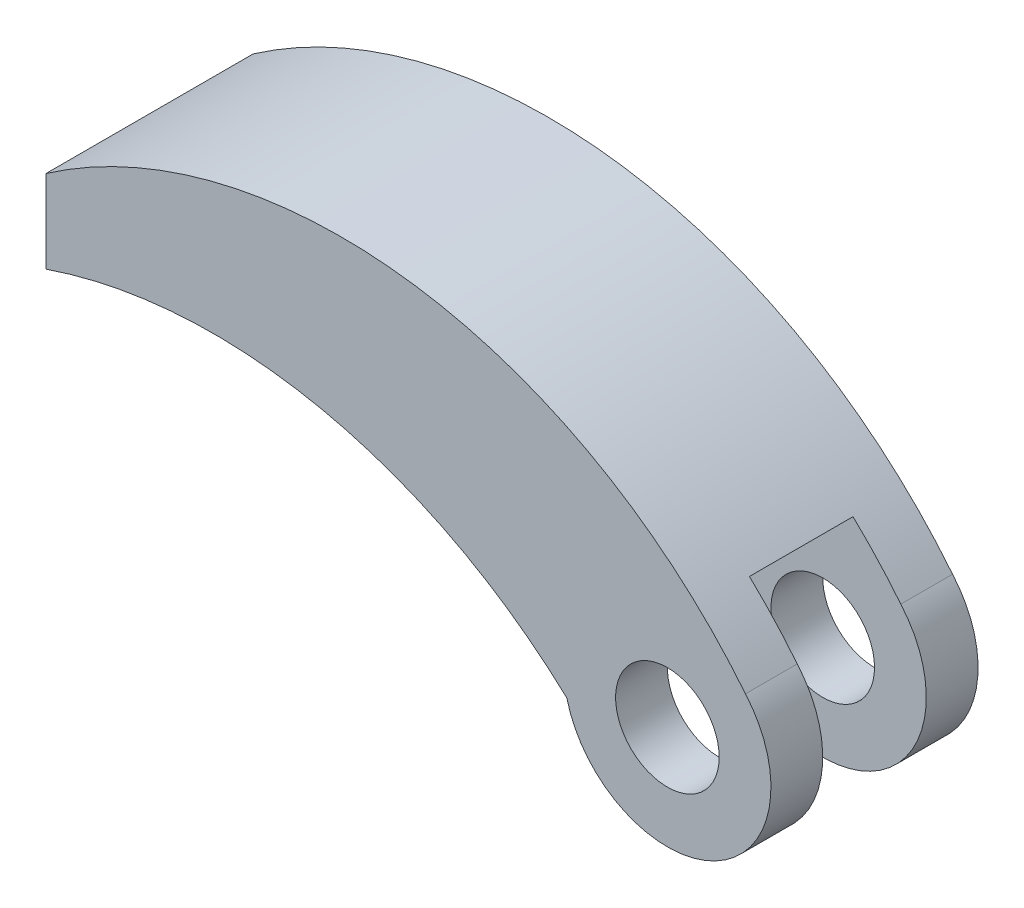
ISO-10303-21;
HEADER;
FILE_DESCRIPTION(('STEP AP214'),'2;1');
FILE_NAME('part.step','',(''),(''),'','','');
FILE_SCHEMA(('AUTOMOTIVE_DESIGN { 1 0 10303 214 1 1 1 1 }'));
ENDSEC;
DATA;
#1=APPLICATION_CONTEXT('core data for automotive mechanical design processes');
#2=APPLICATION_PROTOCOL_DEFINITION('international standard','automotive_design',2000,#1);
#3=PRODUCT_CONTEXT('',#1,'mechanical');
#4=PRODUCT('Part','Part','',(#3));
#5=PRODUCT_RELATED_PRODUCT_CATEGORY('part','',(#4));
#6=PRODUCT_DEFINITION_FORMATION('','',#4);
#7=PRODUCT_DEFINITION_CONTEXT('part definition',#1,'design');
#8=PRODUCT_DEFINITION('design','',#6,#7);
#9=PRODUCT_DEFINITION_SHAPE('','',#8);
#10=(LENGTH_UNIT() NAMED_UNIT(*) SI_UNIT(.MILLI.,.METRE.));
#11=(NAMED_UNIT(*) PLANE_ANGLE_UNIT() SI_UNIT($,.RADIAN.));
#12=(NAMED_UNIT(*) SI_UNIT($,.STERADIAN.) SOLID_ANGLE_UNIT());
#13=UNCERTAINTY_MEASURE_WITH_UNIT(LENGTH_MEASURE(1.E-05),#10,'distance_accuracy_value','');
#14=(GEOMETRIC_REPRESENTATION_CONTEXT(3) GLOBAL_UNCERTAINTY_ASSIGNED_CONTEXT((#13)) GLOBAL_UNIT_ASSIGNED_CONTEXT((#10,
#11,#12)) REPRESENTATION_CONTEXT('',''));
#15=CARTESIAN_POINT('',(0.,0.,0.));
#16=DIRECTION('',(0.,0.,1.));
#17=DIRECTION('',(1.,0.,0.));
#18=AXIS2_PLACEMENT_3D('',#15,#16,#17);
#19=CARTESIAN_POINT('',(0.,0.,10.));
#20=DIRECTION('',(0.,0.,-1.));
#21=DIRECTION('',(-1.,0.,0.));
#22=AXIS2_PLACEMENT_3D('',#19,#20,#21);
#23=CYLINDRICAL_SURFACE('',#22,5.);
#24=CARTESIAN_POINT('',(0.,0.,2.5));
#25=DIRECTION('',(0.,0.,1.));
#26=DIRECTION('',(1.,0.,0.));
#27=AXIS2_PLACEMENT_3D('',#24,#25,#26);
#28=CIRCLE('',#27,5.);
#29=CARTESIAN_POINT('',(-4.85386703858293,-1.19998948818653,2.5));
#30=VERTEX_POINT('',#29);
#31=CARTESIAN_POINT('',(3.76901553288614,3.28550177489878,2.5));
#32=VERTEX_POINT('',#31);
#33=EDGE_CURVE('E60',#30,#32,#28,.T.);
#34=ORIENTED_EDGE('',*,*,#33,.F.);
#35=DIRECTION('',(0.,0.,-1.));
#36=VECTOR('',#35,1.);
#37=CARTESIAN_POINT('',(-4.85386703858293,-1.19998948818653,5.));
#38=LINE('',#37,#36);
#39=CARTESIAN_POINT('',(-4.85386703858293,-1.19998948818653,0.));
#40=VERTEX_POINT('',#39);
#41=EDGE_CURVE('E141',#40,#30,#38,.F.);
#42=ORIENTED_EDGE('',*,*,#41,.F.);
#43=CARTESIAN_POINT('',(0.,0.,0.));
#44=DIRECTION('',(0.,0.,1.));
#45=DIRECTION('',(1.,0.,0.));
#46=AXIS2_PLACEMENT_3D('',#43,#44,#45);
#47=CIRCLE('',#46,5.);
#48=CARTESIAN_POINT('',(3.76901553288614,3.28550177489878,0.));
#49=VERTEX_POINT('',#48);
#50=EDGE_CURVE('E132',#40,#49,#47,.T.);
#51=ORIENTED_EDGE('',*,*,#50,.T.);
#52=DIRECTION('',(0.,0.,-1.));
#53=VECTOR('',#52,1.);
#54=CARTESIAN_POINT('',(3.76901553288614,3.28550177489878,10.));
#55=LINE('',#54,#53);
#56=EDGE_CURVE('E154',#32,#49,#55,.T.);
#57=ORIENTED_EDGE('',*,*,#56,.F.);
#58=EDGE_LOOP('',(#34,#42,#51,#57));
#59=FACE_BOUND('',#58,.T.);
#60=ADVANCED_FACE('F45',(#59),#23,.T.);
#61=CARTESIAN_POINT('',(0.,0.,0.));
#62=DIRECTION('',(0.,0.,1.));
#63=DIRECTION('',(1.,0.,0.));
#64=AXIS2_PLACEMENT_3D('',#61,#62,#63);
#65=CYLINDRICAL_SURFACE('',#64,2.5);
#66=CARTESIAN_POINT('',(0.,0.,0.));
#67=DIRECTION('',(0.,0.,1.));
#68=DIRECTION('',(1.,0.,0.));
#69=AXIS2_PLACEMENT_3D('',#66,#67,#68);
#70=CIRCLE('',#69,2.5);
#71=CARTESIAN_POINT('',(2.5,0.,0.));
#72=VERTEX_POINT('',#71);
#73=EDGE_CURVE('E135',#72,#72,#70,.T.);
#74=ORIENTED_EDGE('',*,*,#73,.F.);
#75=EDGE_LOOP('',(#74));
#76=FACE_BOUND('',#75,.T.);
#77=CARTESIAN_POINT('',(0.,0.,2.5));
#78=DIRECTION('',(0.,0.,1.));
#79=DIRECTION('',(1.,0.,0.));
#80=AXIS2_PLACEMENT_3D('',#77,#78,#79);
#81=CIRCLE('',#80,2.5);
#82=CARTESIAN_POINT('',(2.5,0.,2.5));
#83=VERTEX_POINT('',#82);
#84=EDGE_CURVE('E180',#83,#83,#81,.F.);
#85=ORIENTED_EDGE('',*,*,#84,.F.);
#86=EDGE_LOOP('',(#85));
#87=FACE_BOUND('',#86,.T.);
#88=ADVANCED_FACE('F213',(#76,#87),#65,.F.);
#89=CARTESIAN_POINT('',(-4.85386703858293,-1.19998948818653,7.5));
#90=VERTEX_POINT('',#89);
#91=CARTESIAN_POINT('',(-4.85386703858293,-1.19998948818653,10.));
#92=VERTEX_POINT('',#91);
#93=EDGE_CURVE('E68',#90,#92,#38,.F.);
#94=ORIENTED_EDGE('',*,*,#93,.F.);
#95=CARTESIAN_POINT('',(0.,0.,7.5));
#96=DIRECTION('',(0.,0.,1.));
#97=DIRECTION('',(1.,0.,0.));
#98=AXIS2_PLACEMENT_3D('',#95,#96,#97);
#99=CIRCLE('',#98,5.);
#100=CARTESIAN_POINT('',(3.76901553288614,3.28550177489878,7.5));
#101=VERTEX_POINT('',#100);
#102=EDGE_CURVE('E177',#90,#101,#99,.T.);
#103=ORIENTED_EDGE('',*,*,#102,.T.);
#104=CARTESIAN_POINT('',(3.76901553288614,3.28550177489878,10.));
#105=VERTEX_POINT('',#104);
#106=EDGE_CURVE('E152',#105,#101,#55,.T.);
#107=ORIENTED_EDGE('',*,*,#106,.F.);
#108=CARTESIAN_POINT('',(0.,0.,10.));
#109=DIRECTION('',(0.,0.,1.));
#110=DIRECTION('',(1.,0.,0.));
#111=AXIS2_PLACEMENT_3D('',#108,#109,#110);
#112=CIRCLE('',#111,5.);
#113=EDGE_CURVE('E119',#92,#105,#112,.T.);
#114=ORIENTED_EDGE('',*,*,#113,.F.);
#115=EDGE_LOOP('',(#94,#103,#107,#114));
#116=FACE_BOUND('',#115,.T.);
#117=ADVANCED_FACE('F47',(#116),#23,.T.);
#118=CARTESIAN_POINT('',(0.,0.,7.5));
#119=DIRECTION('',(0.,0.,1.));
#120=DIRECTION('',(1.,0.,0.));
#121=AXIS2_PLACEMENT_3D('',#118,#119,#120);
#122=CIRCLE('',#121,2.5);
#123=CARTESIAN_POINT('',(2.5,0.,7.5));
#124=VERTEX_POINT('',#123);
#125=EDGE_CURVE('E172',#124,#124,#122,.F.);
#126=ORIENTED_EDGE('',*,*,#125,.T.);
#127=EDGE_LOOP('',(#126));
#128=FACE_BOUND('',#127,.T.);
#129=CARTESIAN_POINT('',(0.,0.,10.));
#130=DIRECTION('',(0.,0.,1.));
#131=DIRECTION('',(1.,0.,0.));
#132=AXIS2_PLACEMENT_3D('',#129,#130,#131);
#133=CIRCLE('',#132,2.5);
#134=CARTESIAN_POINT('',(2.5,0.,10.));
#135=VERTEX_POINT('',#134);
#136=EDGE_CURVE('E138',#135,#135,#133,.T.);
#137=ORIENTED_EDGE('',*,*,#136,.T.);
#138=EDGE_LOOP('',(#137));
#139=FACE_BOUND('',#138,.T.);
#140=ADVANCED_FACE('F209',(#128,#139),#65,.F.);
#141=CARTESIAN_POINT('',(0.,0.,10.));
#142=DIRECTION('',(0.,0.,1.));
#143=DIRECTION('',(1.,0.,0.));
#144=AXIS2_PLACEMENT_3D('',#141,#142,#143);
#145=PLANE('',#144);
#146=ORIENTED_EDGE('',*,*,#136,.F.);
#147=EDGE_LOOP('',(#146));
#148=FACE_BOUND('',#147,.T.);
#149=ORIENTED_EDGE('',*,*,#113,.T.);
#150=CARTESIAN_POINT('',(-15.7245763228667,-12.3669701244955,10.));
#151=DIRECTION('',(0.,0.,1.));
#152=DIRECTION('',(1.,0.,0.));
#153=AXIS2_PLACEMENT_3D('',#150,#151,#152);
#154=CIRCLE('',#153,25.);
#155=CARTESIAN_POINT('',(-30.,8.15648667104317,10.));
#156=VERTEX_POINT('',#155);
#157=EDGE_CURVE('E158',#105,#156,#154,.T.);
#158=ORIENTED_EDGE('',*,*,#157,.T.);
#159=DIRECTION('',(0.,-1.,0.));
#160=VECTOR('',#159,1.);
#161=CARTESIAN_POINT('',(-30.,8.15648667104317,10.));
#162=LINE('',#161,#160);
#163=CARTESIAN_POINT('',(-30.,4.15648667104317,10.));
#164=VERTEX_POINT('',#163);
#165=EDGE_CURVE('E167',#156,#164,#162,.T.);
#166=ORIENTED_EDGE('',*,*,#165,.T.);
#167=CARTESIAN_POINT('',(-21.894082692739,-19.4929129959219,10.));
#168=DIRECTION('',(0.,0.,-1.));
#169=DIRECTION('',(1.,0.,0.));
#170=AXIS2_PLACEMENT_3D('',#167,#168,#169);
#171=CIRCLE('',#170,25.);
#172=EDGE_CURVE('E164',#164,#92,#171,.T.);
#173=ORIENTED_EDGE('',*,*,#172,.T.);
#174=EDGE_LOOP('',(#149,#158,#166,#173));
#175=FACE_BOUND('',#174,.T.);
#176=ADVANCED_FACE('F201',(#148,#175),#145,.T.);
#177=CARTESIAN_POINT('',(0.,0.,0.));
#178=DIRECTION('',(0.,0.,1.));
#179=DIRECTION('',(1.,0.,0.));
#180=AXIS2_PLACEMENT_3D('',#177,#178,#179);
#181=PLANE('',#180);
#182=ORIENTED_EDGE('',*,*,#50,.F.);
#183=CARTESIAN_POINT('',(-21.894082692739,-19.4929129959219,0.));
#184=DIRECTION('',(0.,0.,-1.));
#185=DIRECTION('',(1.,0.,0.));
#186=AXIS2_PLACEMENT_3D('',#183,#184,#185);
#187=CIRCLE('',#186,25.);
#188=CARTESIAN_POINT('',(-30.,4.15648667104317,0.));
#189=VERTEX_POINT('',#188);
#190=EDGE_CURVE('E155',#189,#40,#187,.T.);
#191=ORIENTED_EDGE('',*,*,#190,.F.);
#192=DIRECTION('',(0.,-1.,0.));
#193=VECTOR('',#192,1.);
#194=CARTESIAN_POINT('',(-30.,8.15648667104317,0.));
#195=LINE('',#194,#193);
#196=CARTESIAN_POINT('',(-30.,8.15648667104317,0.));
#197=VERTEX_POINT('',#196);
#198=EDGE_CURVE('E159',#197,#189,#195,.T.);
#199=ORIENTED_EDGE('',*,*,#198,.F.);
#200=CARTESIAN_POINT('',(-15.7245763228667,-12.3669701244955,0.));
#201=DIRECTION('',(0.,0.,1.));
#202=DIRECTION('',(1.,0.,0.));
#203=AXIS2_PLACEMENT_3D('',#200,#201,#202);
#204=CIRCLE('',#203,25.);
#205=EDGE_CURVE('E161',#49,#197,#204,.T.);
#206=ORIENTED_EDGE('',*,*,#205,.F.);
#207=EDGE_LOOP('',(#182,#191,#199,#206));
#208=FACE_BOUND('',#207,.T.);
#209=ORIENTED_EDGE('',*,*,#73,.T.);
#210=EDGE_LOOP('',(#209));
#211=FACE_BOUND('',#210,.T.);
#212=ADVANCED_FACE('F194',(#208,#211),#181,.F.);
#213=CARTESIAN_POINT('',(-21.894082692739,-19.4929129959219,10.));
#214=DIRECTION('',(0.,0.,-1.));
#215=DIRECTION('',(-1.,0.,0.));
#216=AXIS2_PLACEMENT_3D('',#213,#214,#215);
#217=CYLINDRICAL_SURFACE('',#216,25.);
#218=DIRECTION('',(0.,0.,-1.));
#219=VECTOR('',#218,1.);
#220=CARTESIAN_POINT('',(-6.26556489397308,0.0198887355993766,5.));
#221=LINE('',#220,#219);
#222=CARTESIAN_POINT('',(-6.26556489397308,0.0198887355993722,7.5));
#223=VERTEX_POINT('',#222);
#224=CARTESIAN_POINT('',(-6.26556489397308,0.0198887355993722,2.5));
#225=VERTEX_POINT('',#224);
#226=EDGE_CURVE('E126',#223,#225,#221,.T.);
#227=ORIENTED_EDGE('',*,*,#226,.F.);
#228=CARTESIAN_POINT('',(-21.894082692739,-19.4929129959219,7.5));
#229=DIRECTION('',(0.,0.,1.));
#230=DIRECTION('',(1.,0.,0.));
#231=AXIS2_PLACEMENT_3D('',#228,#229,#230);
#232=CIRCLE('',#231,25.);
#233=EDGE_CURVE('E175',#223,#90,#232,.F.);
#234=ORIENTED_EDGE('',*,*,#233,.T.);
#235=ORIENTED_EDGE('',*,*,#93,.T.);
#236=ORIENTED_EDGE('',*,*,#172,.F.);
#237=DIRECTION('',(0.,0.,-1.));
#238=VECTOR('',#237,1.);
#239=CARTESIAN_POINT('',(-30.,4.15648667104317,10.));
#240=LINE('',#239,#238);
#241=EDGE_CURVE('E149',#164,#189,#240,.T.);
#242=ORIENTED_EDGE('',*,*,#241,.T.);
#243=ORIENTED_EDGE('',*,*,#190,.T.);
#244=ORIENTED_EDGE('',*,*,#41,.T.);
#245=CARTESIAN_POINT('',(-21.894082692739,-19.4929129959219,2.5));
#246=DIRECTION('',(0.,0.,1.));
#247=DIRECTION('',(1.,0.,0.));
#248=AXIS2_PLACEMENT_3D('',#245,#246,#247);
#249=CIRCLE('',#248,25.);
#250=EDGE_CURVE('E183',#225,#30,#249,.F.);
#251=ORIENTED_EDGE('',*,*,#250,.F.);
#252=EDGE_LOOP('',(#227,#234,#235,#236,#242,#243,#244,#251));
#253=FACE_BOUND('',#252,.T.);
#254=ADVANCED_FACE('F187',(#253),#217,.F.);
#255=CARTESIAN_POINT('',(-15.7245763228667,-12.3669701244955,10.));
#256=DIRECTION('',(0.,0.,-1.));
#257=DIRECTION('',(-1.,0.,0.));
#258=AXIS2_PLACEMENT_3D('',#255,#256,#257);
#259=CYLINDRICAL_SURFACE('',#258,25.);
#260=ORIENTED_EDGE('',*,*,#106,.T.);
#261=CARTESIAN_POINT('',(-15.7245763228667,-12.3669701244955,7.5));
#262=DIRECTION('',(0.,0.,1.));
#263=DIRECTION('',(1.,0.,0.));
#264=AXIS2_PLACEMENT_3D('',#261,#262,#263);
#265=CIRCLE('',#264,25.);
#266=CARTESIAN_POINT('',(1.46152788418757,5.78896064713591,7.5));
#267=VERTEX_POINT('',#266);
#268=EDGE_CURVE('E13',#101,#267,#265,.T.);
#269=ORIENTED_EDGE('',*,*,#268,.T.);
#270=DIRECTION('',(0.,0.,-1.));
#271=VECTOR('',#270,1.);
#272=CARTESIAN_POINT('',(1.46152788418756,5.78896064713591,5.));
#273=LINE('',#272,#271);
#274=CARTESIAN_POINT('',(1.46152788418757,5.78896064713591,2.5));
#275=VERTEX_POINT('',#274);
#276=EDGE_CURVE('E53',#275,#267,#273,.F.);
#277=ORIENTED_EDGE('',*,*,#276,.F.);
#278=CARTESIAN_POINT('',(-15.7245763228667,-12.3669701244955,2.5));
#279=DIRECTION('',(0.,0.,1.));
#280=DIRECTION('',(1.,0.,0.));
#281=AXIS2_PLACEMENT_3D('',#278,#279,#280);
#282=CIRCLE('',#281,25.);
#283=EDGE_CURVE('E110',#32,#275,#282,.T.);
#284=ORIENTED_EDGE('',*,*,#283,.F.);
#285=ORIENTED_EDGE('',*,*,#56,.T.);
#286=ORIENTED_EDGE('',*,*,#205,.T.);
#287=DIRECTION('',(0.,0.,-1.));
#288=VECTOR('',#287,1.);
#289=CARTESIAN_POINT('',(-30.,8.15648667104317,10.));
#290=LINE('',#289,#288);
#291=EDGE_CURVE('E146',#156,#197,#290,.T.);
#292=ORIENTED_EDGE('',*,*,#291,.F.);
#293=ORIENTED_EDGE('',*,*,#157,.F.);
#294=EDGE_LOOP('',(#260,#269,#277,#284,#285,#286,#292,#293));
#295=FACE_BOUND('',#294,.T.);
#296=ADVANCED_FACE('F130',(#295),#259,.T.);
#297=CARTESIAN_POINT('',(-30.,8.15648667104317,10.));
#298=DIRECTION('',(1.,0.,0.));
#299=DIRECTION('',(0.,0.,-1.));
#300=AXIS2_PLACEMENT_3D('',#297,#298,#299);
#301=PLANE('',#300);
#302=ORIENTED_EDGE('',*,*,#198,.T.);
#303=ORIENTED_EDGE('',*,*,#241,.F.);
#304=ORIENTED_EDGE('',*,*,#165,.F.);
#305=ORIENTED_EDGE('',*,*,#291,.T.);
#306=EDGE_LOOP('',(#302,#303,#304,#305));
#307=FACE_BOUND('',#306,.T.);
#308=ADVANCED_FACE('F199',(#307),#301,.F.);
#309=CARTESIAN_POINT('',(2.83921642506271,-4.11568342947488,7.5));
#310=DIRECTION('',(0.,0.,-1.));
#311=DIRECTION('',(-1.,0.,0.));
#312=AXIS2_PLACEMENT_3D('',#309,#310,#311);
#313=CYLINDRICAL_SURFACE('',#312,10.);
#314=ORIENTED_EDGE('',*,*,#226,.T.);
#315=CARTESIAN_POINT('',(2.83921642506271,-4.11568342947488,2.5));
#316=DIRECTION('',(0.,0.,1.));
#317=DIRECTION('',(1.,0.,0.));
#318=AXIS2_PLACEMENT_3D('',#315,#316,#317);
#319=CIRCLE('',#318,10.);
#320=EDGE_CURVE('E114',#275,#225,#319,.T.);
#321=ORIENTED_EDGE('',*,*,#320,.F.);
#322=ORIENTED_EDGE('',*,*,#276,.T.);
#323=CARTESIAN_POINT('',(2.83921642506271,-4.11568342947488,7.5));
#324=DIRECTION('',(0.,0.,1.));
#325=DIRECTION('',(1.,0.,0.));
#326=AXIS2_PLACEMENT_3D('',#323,#324,#325);
#327=CIRCLE('',#326,10.);
#328=EDGE_CURVE('E127',#267,#223,#327,.T.);
#329=ORIENTED_EDGE('',*,*,#328,.T.);
#330=EDGE_LOOP('',(#314,#321,#322,#329));
#331=FACE_BOUND('',#330,.T.);
#332=ADVANCED_FACE('F122',(#331),#313,.F.);
#333=CARTESIAN_POINT('',(2.83921642506271,-4.11568342947488,7.5));
#334=DIRECTION('',(0.,0.,1.));
#335=DIRECTION('',(1.,0.,0.));
#336=AXIS2_PLACEMENT_3D('',#333,#334,#335);
#337=PLANE('',#336);
#338=ORIENTED_EDGE('',*,*,#328,.F.);
#339=ORIENTED_EDGE('',*,*,#268,.F.);
#340=ORIENTED_EDGE('',*,*,#102,.F.);
#341=ORIENTED_EDGE('',*,*,#233,.F.);
#342=EDGE_LOOP('',(#338,#339,#340,#341));
#343=FACE_BOUND('',#342,.T.);
#344=ORIENTED_EDGE('',*,*,#125,.F.);
#345=EDGE_LOOP('',(#344));
#346=FACE_BOUND('',#345,.T.);
#347=ADVANCED_FACE('F203',(#343,#346),#337,.F.);
#348=CARTESIAN_POINT('',(2.83921642506271,-4.11568342947488,2.5));
#349=DIRECTION('',(0.,0.,1.));
#350=DIRECTION('',(1.,0.,0.));
#351=AXIS2_PLACEMENT_3D('',#348,#349,#350);
#352=PLANE('',#351);
#353=ORIENTED_EDGE('',*,*,#250,.T.);
#354=ORIENTED_EDGE('',*,*,#33,.T.);
#355=ORIENTED_EDGE('',*,*,#283,.T.);
#356=ORIENTED_EDGE('',*,*,#320,.T.);
#357=EDGE_LOOP('',(#353,#354,#355,#356));
#358=FACE_BOUND('',#357,.T.);
#359=ORIENTED_EDGE('',*,*,#84,.T.);
#360=EDGE_LOOP('',(#359));
#361=FACE_BOUND('',#360,.T.);
#362=ADVANCED_FACE('F112',(#358,#361),#352,.T.);
#363=CLOSED_SHELL('',(#60,#88,#117,#140,#176,#212,#254,#296,#308,#332,#347,#362));
#364=MANIFOLD_SOLID_BREP('B2',#363);
#365=ADVANCED_BREP_SHAPE_REPRESENTATION('',(#18,#364),#14);
#366=SHAPE_DEFINITION_REPRESENTATION(#9,#365);
ENDSEC;
END-ISO-10303-21;
